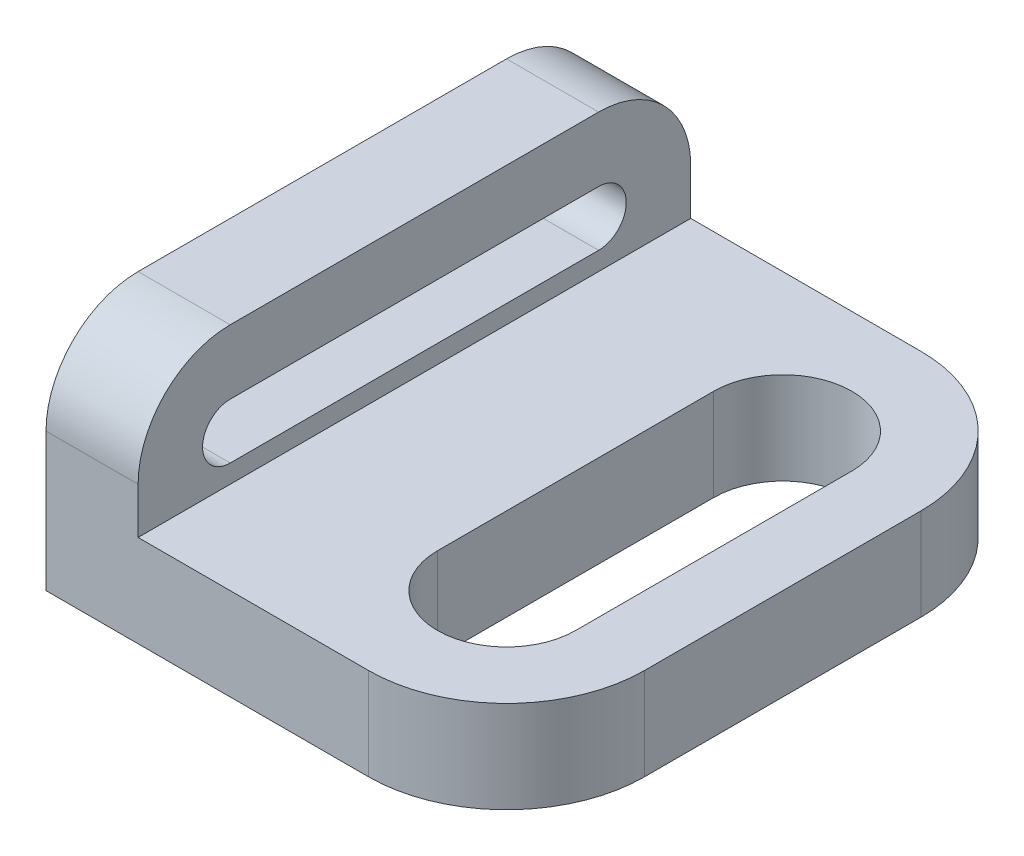
ISO-10303-21;
HEADER;
FILE_DESCRIPTION(('STEP AP214'),'2;1');
FILE_NAME('part.step','',(''),(''),'','','');
FILE_SCHEMA(('AUTOMOTIVE_DESIGN { 1 0 10303 214 1 1 1 1 }'));
ENDSEC;
DATA;
#1=APPLICATION_CONTEXT('core data for automotive mechanical design processes');
#2=APPLICATION_PROTOCOL_DEFINITION('international standard','automotive_design',2000,#1);
#3=PRODUCT_CONTEXT('',#1,'mechanical');
#4=PRODUCT('Part','Part','',(#3));
#5=PRODUCT_RELATED_PRODUCT_CATEGORY('part','',(#4));
#6=PRODUCT_DEFINITION_FORMATION('','',#4);
#7=PRODUCT_DEFINITION_CONTEXT('part definition',#1,'design');
#8=PRODUCT_DEFINITION('design','',#6,#7);
#9=PRODUCT_DEFINITION_SHAPE('','',#8);
#10=(LENGTH_UNIT() NAMED_UNIT(*) SI_UNIT(.MILLI.,.METRE.));
#11=(NAMED_UNIT(*) PLANE_ANGLE_UNIT() SI_UNIT($,.RADIAN.));
#12=(NAMED_UNIT(*) SI_UNIT($,.STERADIAN.) SOLID_ANGLE_UNIT());
#13=UNCERTAINTY_MEASURE_WITH_UNIT(LENGTH_MEASURE(1.E-05),#10,'distance_accuracy_value','');
#14=(GEOMETRIC_REPRESENTATION_CONTEXT(3) GLOBAL_UNCERTAINTY_ASSIGNED_CONTEXT((#13)) GLOBAL_UNIT_ASSIGNED_CONTEXT((#10,
#11,#12)) REPRESENTATION_CONTEXT('',''));
#15=CARTESIAN_POINT('',(0.,0.,0.));
#16=DIRECTION('',(0.,0.,1.));
#17=DIRECTION('',(1.,0.,0.));
#18=AXIS2_PLACEMENT_3D('',#15,#16,#17);
#19=CARTESIAN_POINT('',(35.,20.,0.));
#20=DIRECTION('',(-1.,0.,0.));
#21=DIRECTION('',(0.,0.,1.));
#22=AXIS2_PLACEMENT_3D('',#19,#20,#21);
#23=PLANE('',#22);
#24=DIRECTION('',(0.,0.,-1.));
#25=VECTOR('',#24,1.);
#26=CARTESIAN_POINT('',(35.,0.,0.));
#27=LINE('',#26,#25);
#28=CARTESIAN_POINT('',(35.,0.,30.));
#29=VERTEX_POINT('',#28);
#30=CARTESIAN_POINT('',(35.,0.,-30.));
#31=VERTEX_POINT('',#30);
#32=EDGE_CURVE('E183',#29,#31,#27,.T.);
#33=ORIENTED_EDGE('',*,*,#32,.F.);
#34=DIRECTION('',(0.,-1.,0.));
#35=VECTOR('',#34,1.);
#36=CARTESIAN_POINT('',(35.,20.,30.));
#37=LINE('',#36,#35);
#38=CARTESIAN_POINT('',(35.,20.,30.));
#39=VERTEX_POINT('',#38);
#40=EDGE_CURVE('E11',#39,#29,#37,.T.);
#41=ORIENTED_EDGE('',*,*,#40,.F.);
#42=DIRECTION('',(0.,0.,-1.));
#43=VECTOR('',#42,1.);
#44=CARTESIAN_POINT('',(35.,20.,0.));
#45=LINE('',#44,#43);
#46=CARTESIAN_POINT('',(35.,20.,-30.));
#47=VERTEX_POINT('',#46);
#48=EDGE_CURVE('E136',#39,#47,#45,.T.);
#49=ORIENTED_EDGE('',*,*,#48,.T.);
#50=DIRECTION('',(0.,-1.,0.));
#51=VECTOR('',#50,1.);
#52=CARTESIAN_POINT('',(35.,20.,-30.));
#53=LINE('',#52,#51);
#54=EDGE_CURVE('E68',#47,#31,#53,.T.);
#55=ORIENTED_EDGE('',*,*,#54,.T.);
#56=EDGE_LOOP('',(#33,#41,#49,#55));
#57=FACE_BOUND('',#56,.T.);
#58=ADVANCED_FACE('F41',(#57),#23,.T.);
#59=CARTESIAN_POINT('',(20.,20.,30.));
#60=DIRECTION('',(0.,-1.,0.));
#61=DIRECTION('',(0.,0.,-1.));
#62=AXIS2_PLACEMENT_3D('',#59,#60,#61);
#63=CYLINDRICAL_SURFACE('',#62,15.);
#64=CARTESIAN_POINT('',(20.,0.,30.));
#65=DIRECTION('',(0.,1.,0.));
#66=DIRECTION('',(0.,0.,1.));
#67=AXIS2_PLACEMENT_3D('',#64,#65,#66);
#68=CIRCLE('',#67,15.);
#69=CARTESIAN_POINT('',(5.00000000000003,0.,30.));
#70=VERTEX_POINT('',#69);
#71=EDGE_CURVE('E143',#29,#70,#68,.F.);
#72=ORIENTED_EDGE('',*,*,#71,.T.);
#73=DIRECTION('',(0.,-1.,0.));
#74=VECTOR('',#73,1.);
#75=CARTESIAN_POINT('',(5.00000000000003,20.,30.));
#76=LINE('',#75,#74);
#77=CARTESIAN_POINT('',(5.00000000000003,20.,30.));
#78=VERTEX_POINT('',#77);
#79=EDGE_CURVE('E51',#78,#70,#76,.T.);
#80=ORIENTED_EDGE('',*,*,#79,.F.);
#81=CARTESIAN_POINT('',(20.,20.,30.));
#82=DIRECTION('',(0.,1.,0.));
#83=DIRECTION('',(0.,0.,1.));
#84=AXIS2_PLACEMENT_3D('',#81,#82,#83);
#85=CIRCLE('',#84,15.);
#86=EDGE_CURVE('E130',#39,#78,#85,.F.);
#87=ORIENTED_EDGE('',*,*,#86,.F.);
#88=ORIENTED_EDGE('',*,*,#40,.T.);
#89=EDGE_LOOP('',(#72,#80,#87,#88));
#90=FACE_BOUND('',#89,.T.);
#91=ADVANCED_FACE('F141',(#90),#63,.F.);
#92=CARTESIAN_POINT('',(5.00000000000001,20.,0.));
#93=DIRECTION('',(1.,0.,0.));
#94=DIRECTION('',(0.,0.,-1.));
#95=AXIS2_PLACEMENT_3D('',#92,#93,#94);
#96=PLANE('',#95);
#97=DIRECTION('',(0.,0.,1.));
#98=VECTOR('',#97,1.);
#99=CARTESIAN_POINT('',(5.00000000000001,0.,0.));
#100=LINE('',#99,#98);
#101=CARTESIAN_POINT('',(5.,0.,-30.));
#102=VERTEX_POINT('',#101);
#103=EDGE_CURVE('E188',#102,#70,#100,.T.);
#104=ORIENTED_EDGE('',*,*,#103,.F.);
#105=DIRECTION('',(0.,-1.,0.));
#106=VECTOR('',#105,1.);
#107=CARTESIAN_POINT('',(5.,20.,-30.));
#108=LINE('',#107,#106);
#109=CARTESIAN_POINT('',(5.,20.,-30.));
#110=VERTEX_POINT('',#109);
#111=EDGE_CURVE('E148',#110,#102,#108,.T.);
#112=ORIENTED_EDGE('',*,*,#111,.F.);
#113=DIRECTION('',(0.,0.,1.));
#114=VECTOR('',#113,1.);
#115=CARTESIAN_POINT('',(5.00000000000001,20.,0.));
#116=LINE('',#115,#114);
#117=EDGE_CURVE('E135',#110,#78,#116,.T.);
#118=ORIENTED_EDGE('',*,*,#117,.T.);
#119=ORIENTED_EDGE('',*,*,#79,.T.);
#120=EDGE_LOOP('',(#104,#112,#118,#119));
#121=FACE_BOUND('',#120,.T.);
#122=ADVANCED_FACE('F150',(#121),#96,.T.);
#123=CARTESIAN_POINT('',(20.,20.,-30.));
#124=DIRECTION('',(0.,-1.,0.));
#125=DIRECTION('',(0.,0.,-1.));
#126=AXIS2_PLACEMENT_3D('',#123,#124,#125);
#127=CYLINDRICAL_SURFACE('',#126,30.);
#128=CARTESIAN_POINT('',(20.,0.,-30.));
#129=DIRECTION('',(0.,1.,0.));
#130=DIRECTION('',(0.,0.,1.));
#131=AXIS2_PLACEMENT_3D('',#128,#129,#130);
#132=CIRCLE('',#131,30.);
#133=CARTESIAN_POINT('',(19.9999999999998,0.,-60.));
#134=VERTEX_POINT('',#133);
#135=CARTESIAN_POINT('',(50.,0.,-29.9999999999998));
#136=VERTEX_POINT('',#135);
#137=EDGE_CURVE('E160',#134,#136,#132,.F.);
#138=ORIENTED_EDGE('',*,*,#137,.F.);
#139=DIRECTION('',(0.,-1.,0.));
#140=VECTOR('',#139,1.);
#141=CARTESIAN_POINT('',(19.9999999999998,20.,-60.));
#142=LINE('',#141,#140);
#143=CARTESIAN_POINT('',(19.9999999999998,20.,-60.));
#144=VERTEX_POINT('',#143);
#145=EDGE_CURVE('E45',#144,#134,#142,.T.);
#146=ORIENTED_EDGE('',*,*,#145,.F.);
#147=CARTESIAN_POINT('',(20.,20.,-30.));
#148=DIRECTION('',(0.,1.,0.));
#149=DIRECTION('',(0.,0.,1.));
#150=AXIS2_PLACEMENT_3D('',#147,#148,#149);
#151=CIRCLE('',#150,30.);
#152=CARTESIAN_POINT('',(50.,20.,-29.9999999999998));
#153=VERTEX_POINT('',#152);
#154=EDGE_CURVE('E195',#144,#153,#151,.F.);
#155=ORIENTED_EDGE('',*,*,#154,.T.);
#156=DIRECTION('',(0.,-1.,0.));
#157=VECTOR('',#156,1.);
#158=CARTESIAN_POINT('',(50.,20.,-29.9999999999998));
#159=LINE('',#158,#157);
#160=EDGE_CURVE('E156',#153,#136,#159,.T.);
#161=ORIENTED_EDGE('',*,*,#160,.T.);
#162=EDGE_LOOP('',(#138,#146,#155,#161));
#163=FACE_BOUND('',#162,.T.);
#164=ADVANCED_FACE('F43',(#163),#127,.T.);
#165=CARTESIAN_POINT('',(0.,20.,-60.));
#166=DIRECTION('',(0.,0.,-1.));
#167=DIRECTION('',(-1.,0.,0.));
#168=AXIS2_PLACEMENT_3D('',#165,#166,#167);
#169=PLANE('',#168);
#170=DIRECTION('',(1.,0.,0.));
#171=VECTOR('',#170,1.);
#172=CARTESIAN_POINT('',(0.,0.,-60.));
#173=LINE('',#172,#171);
#174=CARTESIAN_POINT('',(-50.,0.,-60.));
#175=VERTEX_POINT('',#174);
#176=EDGE_CURVE('E164',#175,#134,#173,.T.);
#177=ORIENTED_EDGE('',*,*,#176,.F.);
#178=DIRECTION('',(0.,-1.,0.));
#179=VECTOR('',#178,1.);
#180=CARTESIAN_POINT('',(-50.,20.,-60.));
#181=LINE('',#180,#179);
#182=CARTESIAN_POINT('',(-50.,29.9999999999999,-60.));
#183=VERTEX_POINT('',#182);
#184=EDGE_CURVE('E212',#183,#175,#181,.T.);
#185=ORIENTED_EDGE('',*,*,#184,.F.);
#186=DIRECTION('',(-1.,0.,0.));
#187=VECTOR('',#186,1.);
#188=CARTESIAN_POINT('',(-30.,29.9999999999999,-60.));
#189=LINE('',#188,#187);
#190=CARTESIAN_POINT('',(-30.,29.9999999999999,-60.));
#191=VERTEX_POINT('',#190);
#192=EDGE_CURVE('E165',#191,#183,#189,.T.);
#193=ORIENTED_EDGE('',*,*,#192,.F.);
#194=DIRECTION('',(0.,1.,0.));
#195=VECTOR('',#194,1.);
#196=CARTESIAN_POINT('',(-30.,29.9999999999999,-60.));
#197=LINE('',#196,#195);
#198=CARTESIAN_POINT('',(-30.,20.,-60.));
#199=VERTEX_POINT('',#198);
#200=EDGE_CURVE('E572',#199,#191,#197,.T.);
#201=ORIENTED_EDGE('',*,*,#200,.F.);
#202=DIRECTION('',(1.,0.,0.));
#203=VECTOR('',#202,1.);
#204=CARTESIAN_POINT('',(0.,20.,-60.));
#205=LINE('',#204,#203);
#206=EDGE_CURVE('E111',#199,#144,#205,.T.);
#207=ORIENTED_EDGE('',*,*,#206,.T.);
#208=ORIENTED_EDGE('',*,*,#145,.T.);
#209=EDGE_LOOP('',(#177,#185,#193,#201,#207,#208));
#210=FACE_BOUND('',#209,.T.);
#211=ADVANCED_FACE('F223',(#210),#169,.T.);
#212=CARTESIAN_POINT('',(-50.,20.,0.));
#213=DIRECTION('',(1.,0.,0.));
#214=DIRECTION('',(0.,0.,-1.));
#215=AXIS2_PLACEMENT_3D('',#212,#213,#214);
#216=PLANE('',#215);
#217=DIRECTION('',(0.,0.,1.));
#218=VECTOR('',#217,1.);
#219=CARTESIAN_POINT('',(-50.,0.,0.));
#220=LINE('',#219,#218);
#221=CARTESIAN_POINT('',(-50.,0.,60.));
#222=VERTEX_POINT('',#221);
#223=EDGE_CURVE('E169',#175,#222,#220,.T.);
#224=ORIENTED_EDGE('',*,*,#223,.T.);
#225=DIRECTION('',(0.,-1.,0.));
#226=VECTOR('',#225,1.);
#227=CARTESIAN_POINT('',(-50.,20.,60.));
#228=LINE('',#227,#226);
#229=CARTESIAN_POINT('',(-50.,29.9999999999999,60.));
#230=VERTEX_POINT('',#229);
#231=EDGE_CURVE('E209',#230,#222,#228,.T.);
#232=ORIENTED_EDGE('',*,*,#231,.F.);
#233=CARTESIAN_POINT('',(-50.,30.,40.));
#234=DIRECTION('',(1.,0.,0.));
#235=DIRECTION('',(0.,0.,1.));
#236=AXIS2_PLACEMENT_3D('',#233,#234,#235);
#237=CIRCLE('',#236,20.);
#238=CARTESIAN_POINT('',(-50.,50.,39.9999999999999));
#239=VERTEX_POINT('',#238);
#240=EDGE_CURVE('E268',#239,#230,#237,.T.);
#241=ORIENTED_EDGE('',*,*,#240,.F.);
#242=DIRECTION('',(0.,0.,1.));
#243=VECTOR('',#242,1.);
#244=CARTESIAN_POINT('',(-50.,50.,-39.9999999999999));
#245=LINE('',#244,#243);
#246=CARTESIAN_POINT('',(-50.,50.,-39.9999999999999));
#247=VERTEX_POINT('',#246);
#248=EDGE_CURVE('E585',#247,#239,#245,.T.);
#249=ORIENTED_EDGE('',*,*,#248,.F.);
#250=CARTESIAN_POINT('',(-50.,30.,-40.));
#251=DIRECTION('',(1.,0.,0.));
#252=DIRECTION('',(0.,0.,-1.));
#253=AXIS2_PLACEMENT_3D('',#250,#251,#252);
#254=CIRCLE('',#253,20.);
#255=EDGE_CURVE('E567',#183,#247,#254,.T.);
#256=ORIENTED_EDGE('',*,*,#255,.F.);
#257=ORIENTED_EDGE('',*,*,#184,.T.);
#258=EDGE_LOOP('',(#224,#232,#241,#249,#256,#257));
#259=FACE_BOUND('',#258,.T.);
#260=CARTESIAN_POINT('',(-50.,30.,-40.));
#261=DIRECTION('',(1.,0.,0.));
#262=DIRECTION('',(0.,0.,-1.));
#263=AXIS2_PLACEMENT_3D('',#260,#261,#262);
#264=CIRCLE('',#263,6.);
#265=CARTESIAN_POINT('',(-50.,24.,-40.));
#266=VERTEX_POINT('',#265);
#267=CARTESIAN_POINT('',(-50.,36.,-40.));
#268=VERTEX_POINT('',#267);
#269=EDGE_CURVE('E550',#266,#268,#264,.T.);
#270=ORIENTED_EDGE('',*,*,#269,.T.);
#271=DIRECTION('',(0.,0.,1.));
#272=VECTOR('',#271,1.);
#273=CARTESIAN_POINT('',(-50.,36.,-40.));
#274=LINE('',#273,#272);
#275=CARTESIAN_POINT('',(-50.,36.,40.));
#276=VERTEX_POINT('',#275);
#277=EDGE_CURVE('E544',#268,#276,#274,.T.);
#278=ORIENTED_EDGE('',*,*,#277,.T.);
#279=CARTESIAN_POINT('',(-50.,30.,40.));
#280=DIRECTION('',(1.,0.,0.));
#281=DIRECTION('',(0.,0.,1.));
#282=AXIS2_PLACEMENT_3D('',#279,#280,#281);
#283=CIRCLE('',#282,6.);
#284=CARTESIAN_POINT('',(-50.,24.,40.));
#285=VERTEX_POINT('',#284);
#286=EDGE_CURVE('E539',#276,#285,#283,.T.);
#287=ORIENTED_EDGE('',*,*,#286,.T.);
#288=DIRECTION('',(0.,0.,-1.));
#289=VECTOR('',#288,1.);
#290=CARTESIAN_POINT('',(-50.,24.,40.));
#291=LINE('',#290,#289);
#292=EDGE_CURVE('E524',#285,#266,#291,.T.);
#293=ORIENTED_EDGE('',*,*,#292,.T.);
#294=EDGE_LOOP('',(#270,#278,#287,#293));
#295=FACE_BOUND('',#294,.T.);
#296=ADVANCED_FACE('F234',(#259,#295),#216,.F.);
#297=CARTESIAN_POINT('',(0.,20.,60.));
#298=DIRECTION('',(0.,0.,-1.));
#299=DIRECTION('',(-1.,0.,0.));
#300=AXIS2_PLACEMENT_3D('',#297,#298,#299);
#301=PLANE('',#300);
#302=DIRECTION('',(1.,0.,0.));
#303=VECTOR('',#302,1.);
#304=CARTESIAN_POINT('',(0.,0.,60.));
#305=LINE('',#304,#303);
#306=CARTESIAN_POINT('',(19.9999999999998,0.,60.));
#307=VERTEX_POINT('',#306);
#308=EDGE_CURVE('E172',#222,#307,#305,.T.);
#309=ORIENTED_EDGE('',*,*,#308,.T.);
#310=DIRECTION('',(0.,-1.,0.));
#311=VECTOR('',#310,1.);
#312=CARTESIAN_POINT('',(19.9999999999998,20.,60.));
#313=LINE('',#312,#311);
#314=CARTESIAN_POINT('',(19.9999999999998,20.,60.));
#315=VERTEX_POINT('',#314);
#316=EDGE_CURVE('E205',#315,#307,#313,.T.);
#317=ORIENTED_EDGE('',*,*,#316,.F.);
#318=DIRECTION('',(1.,0.,0.));
#319=VECTOR('',#318,1.);
#320=CARTESIAN_POINT('',(0.,20.,60.));
#321=LINE('',#320,#319);
#322=CARTESIAN_POINT('',(-30.,20.,60.));
#323=VERTEX_POINT('',#322);
#324=EDGE_CURVE('E281',#323,#315,#321,.T.);
#325=ORIENTED_EDGE('',*,*,#324,.F.);
#326=DIRECTION('',(0.,-1.,0.));
#327=VECTOR('',#326,1.);
#328=CARTESIAN_POINT('',(-30.,29.9999999999999,60.));
#329=LINE('',#328,#327);
#330=CARTESIAN_POINT('',(-30.,29.9999999999999,60.));
#331=VERTEX_POINT('',#330);
#332=EDGE_CURVE('E248',#331,#323,#329,.T.);
#333=ORIENTED_EDGE('',*,*,#332,.F.);
#334=DIRECTION('',(-1.,0.,0.));
#335=VECTOR('',#334,1.);
#336=CARTESIAN_POINT('',(-30.,29.9999999999999,60.));
#337=LINE('',#336,#335);
#338=EDGE_CURVE('E245',#331,#230,#337,.T.);
#339=ORIENTED_EDGE('',*,*,#338,.T.);
#340=ORIENTED_EDGE('',*,*,#231,.T.);
#341=EDGE_LOOP('',(#309,#317,#325,#333,#339,#340));
#342=FACE_BOUND('',#341,.T.);
#343=ADVANCED_FACE('F241',(#342),#301,.F.);
#344=CARTESIAN_POINT('',(20.,20.,30.));
#345=DIRECTION('',(0.,-1.,0.));
#346=DIRECTION('',(0.,0.,-1.));
#347=AXIS2_PLACEMENT_3D('',#344,#345,#346);
#348=CYLINDRICAL_SURFACE('',#347,30.);
#349=CARTESIAN_POINT('',(20.,0.,30.));
#350=DIRECTION('',(0.,1.,0.));
#351=DIRECTION('',(0.,0.,1.));
#352=AXIS2_PLACEMENT_3D('',#349,#350,#351);
#353=CIRCLE('',#352,30.);
#354=CARTESIAN_POINT('',(50.,0.,29.9999999999998));
#355=VERTEX_POINT('',#354);
#356=EDGE_CURVE('E175',#307,#355,#353,.T.);
#357=ORIENTED_EDGE('',*,*,#356,.T.);
#358=DIRECTION('',(0.,-1.,0.));
#359=VECTOR('',#358,1.);
#360=CARTESIAN_POINT('',(50.,20.,29.9999999999998));
#361=LINE('',#360,#359);
#362=CARTESIAN_POINT('',(50.,20.,29.9999999999998));
#363=VERTEX_POINT('',#362);
#364=EDGE_CURVE('E202',#363,#355,#361,.T.);
#365=ORIENTED_EDGE('',*,*,#364,.F.);
#366=CARTESIAN_POINT('',(20.,20.,30.));
#367=DIRECTION('',(0.,1.,0.));
#368=DIRECTION('',(0.,0.,1.));
#369=AXIS2_PLACEMENT_3D('',#366,#367,#368);
#370=CIRCLE('',#369,30.);
#371=EDGE_CURVE('E284',#315,#363,#370,.T.);
#372=ORIENTED_EDGE('',*,*,#371,.F.);
#373=ORIENTED_EDGE('',*,*,#316,.T.);
#374=EDGE_LOOP('',(#357,#365,#372,#373));
#375=FACE_BOUND('',#374,.T.);
#376=ADVANCED_FACE('F316',(#375),#348,.T.);
#377=CARTESIAN_POINT('',(50.,20.,0.));
#378=DIRECTION('',(1.,0.,0.));
#379=DIRECTION('',(0.,0.,-1.));
#380=AXIS2_PLACEMENT_3D('',#377,#378,#379);
#381=PLANE('',#380);
#382=DIRECTION('',(0.,0.,1.));
#383=VECTOR('',#382,1.);
#384=CARTESIAN_POINT('',(50.,0.,0.));
#385=LINE('',#384,#383);
#386=EDGE_CURVE('E179',#136,#355,#385,.T.);
#387=ORIENTED_EDGE('',*,*,#386,.F.);
#388=ORIENTED_EDGE('',*,*,#160,.F.);
#389=DIRECTION('',(0.,0.,1.));
#390=VECTOR('',#389,1.);
#391=CARTESIAN_POINT('',(50.,20.,0.));
#392=LINE('',#391,#390);
#393=EDGE_CURVE('E287',#153,#363,#392,.T.);
#394=ORIENTED_EDGE('',*,*,#393,.T.);
#395=ORIENTED_EDGE('',*,*,#364,.T.);
#396=EDGE_LOOP('',(#387,#388,#394,#395));
#397=FACE_BOUND('',#396,.T.);
#398=ADVANCED_FACE('F313',(#397),#381,.T.);
#399=CARTESIAN_POINT('',(20.,20.,-30.));
#400=DIRECTION('',(0.,-1.,0.));
#401=DIRECTION('',(0.,0.,-1.));
#402=AXIS2_PLACEMENT_3D('',#399,#400,#401);
#403=CYLINDRICAL_SURFACE('',#402,15.);
#404=CARTESIAN_POINT('',(20.,0.,-30.));
#405=DIRECTION('',(0.,1.,0.));
#406=DIRECTION('',(0.,0.,1.));
#407=AXIS2_PLACEMENT_3D('',#404,#405,#406);
#408=CIRCLE('',#407,15.);
#409=EDGE_CURVE('E191',#31,#102,#408,.T.);
#410=ORIENTED_EDGE('',*,*,#409,.F.);
#411=ORIENTED_EDGE('',*,*,#54,.F.);
#412=CARTESIAN_POINT('',(20.,20.,-30.));
#413=DIRECTION('',(0.,1.,0.));
#414=DIRECTION('',(0.,0.,1.));
#415=AXIS2_PLACEMENT_3D('',#412,#413,#414);
#416=CIRCLE('',#415,15.);
#417=EDGE_CURVE('E152',#47,#110,#416,.T.);
#418=ORIENTED_EDGE('',*,*,#417,.T.);
#419=ORIENTED_EDGE('',*,*,#111,.T.);
#420=EDGE_LOOP('',(#410,#411,#418,#419));
#421=FACE_BOUND('',#420,.T.);
#422=ADVANCED_FACE('F292',(#421),#403,.F.);
#423=CARTESIAN_POINT('',(0.,20.,0.));
#424=DIRECTION('',(0.,1.,0.));
#425=DIRECTION('',(0.,0.,1.));
#426=AXIS2_PLACEMENT_3D('',#423,#424,#425);
#427=PLANE('',#426);
#428=DIRECTION('',(0.,0.,-1.));
#429=VECTOR('',#428,1.);
#430=CARTESIAN_POINT('',(-30.,20.,-60.));
#431=LINE('',#430,#429);
#432=EDGE_CURVE('E59',#323,#199,#431,.T.);
#433=ORIENTED_EDGE('',*,*,#432,.F.);
#434=ORIENTED_EDGE('',*,*,#324,.T.);
#435=ORIENTED_EDGE('',*,*,#371,.T.);
#436=ORIENTED_EDGE('',*,*,#393,.F.);
#437=ORIENTED_EDGE('',*,*,#154,.F.);
#438=ORIENTED_EDGE('',*,*,#206,.F.);
#439=EDGE_LOOP('',(#433,#434,#435,#436,#437,#438));
#440=FACE_BOUND('',#439,.T.);
#441=ORIENTED_EDGE('',*,*,#48,.F.);
#442=ORIENTED_EDGE('',*,*,#86,.T.);
#443=ORIENTED_EDGE('',*,*,#117,.F.);
#444=ORIENTED_EDGE('',*,*,#417,.F.);
#445=EDGE_LOOP('',(#441,#442,#443,#444));
#446=FACE_BOUND('',#445,.T.);
#447=ADVANCED_FACE('F132',(#440,#446),#427,.T.);
#448=CARTESIAN_POINT('',(0.,0.,0.));
#449=DIRECTION('',(0.,1.,0.));
#450=DIRECTION('',(0.,0.,1.));
#451=AXIS2_PLACEMENT_3D('',#448,#449,#450);
#452=PLANE('',#451);
#453=ORIENTED_EDGE('',*,*,#137,.T.);
#454=ORIENTED_EDGE('',*,*,#386,.T.);
#455=ORIENTED_EDGE('',*,*,#356,.F.);
#456=ORIENTED_EDGE('',*,*,#308,.F.);
#457=ORIENTED_EDGE('',*,*,#223,.F.);
#458=ORIENTED_EDGE('',*,*,#176,.T.);
#459=EDGE_LOOP('',(#453,#454,#455,#456,#457,#458));
#460=FACE_BOUND('',#459,.T.);
#461=ORIENTED_EDGE('',*,*,#32,.T.);
#462=ORIENTED_EDGE('',*,*,#409,.T.);
#463=ORIENTED_EDGE('',*,*,#103,.T.);
#464=ORIENTED_EDGE('',*,*,#71,.F.);
#465=EDGE_LOOP('',(#461,#462,#463,#464));
#466=FACE_BOUND('',#465,.T.);
#467=ADVANCED_FACE('F229',(#460,#466),#452,.F.);
#468=CARTESIAN_POINT('',(-30.,30.,-40.));
#469=DIRECTION('',(1.,0.,0.));
#470=DIRECTION('',(0.,0.,-1.));
#471=AXIS2_PLACEMENT_3D('',#468,#469,#470);
#472=PLANE('',#471);
#473=ORIENTED_EDGE('',*,*,#332,.T.);
#474=ORIENTED_EDGE('',*,*,#432,.T.);
#475=ORIENTED_EDGE('',*,*,#200,.T.);
#476=CARTESIAN_POINT('',(-30.,30.,-40.));
#477=DIRECTION('',(1.,0.,0.));
#478=DIRECTION('',(0.,0.,-1.));
#479=AXIS2_PLACEMENT_3D('',#476,#477,#478);
#480=CIRCLE('',#479,20.);
#481=CARTESIAN_POINT('',(-30.,50.,-39.9999999999999));
#482=VERTEX_POINT('',#481);
#483=EDGE_CURVE('E576',#191,#482,#480,.T.);
#484=ORIENTED_EDGE('',*,*,#483,.T.);
#485=DIRECTION('',(0.,0.,1.));
#486=VECTOR('',#485,1.);
#487=CARTESIAN_POINT('',(-30.,50.,-39.9999999999999));
#488=LINE('',#487,#486);
#489=CARTESIAN_POINT('',(-30.,50.,39.9999999999999));
#490=VERTEX_POINT('',#489);
#491=EDGE_CURVE('E265',#482,#490,#488,.T.);
#492=ORIENTED_EDGE('',*,*,#491,.T.);
#493=CARTESIAN_POINT('',(-30.,30.,40.));
#494=DIRECTION('',(1.,0.,0.));
#495=DIRECTION('',(0.,0.,1.));
#496=AXIS2_PLACEMENT_3D('',#493,#494,#495);
#497=CIRCLE('',#496,20.);
#498=EDGE_CURVE('E256',#490,#331,#497,.T.);
#499=ORIENTED_EDGE('',*,*,#498,.T.);
#500=EDGE_LOOP('',(#473,#474,#475,#484,#492,#499));
#501=FACE_BOUND('',#500,.T.);
#502=DIRECTION('',(0.,0.,1.));
#503=VECTOR('',#502,1.);
#504=CARTESIAN_POINT('',(-30.,36.,-40.));
#505=LINE('',#504,#503);
#506=CARTESIAN_POINT('',(-30.,36.,-40.));
#507=VERTEX_POINT('',#506);
#508=CARTESIAN_POINT('',(-30.,36.,40.));
#509=VERTEX_POINT('',#508);
#510=EDGE_CURVE('E625',#507,#509,#505,.T.);
#511=ORIENTED_EDGE('',*,*,#510,.F.);
#512=CARTESIAN_POINT('',(-30.,30.,-40.));
#513=DIRECTION('',(1.,0.,0.));
#514=DIRECTION('',(0.,0.,-1.));
#515=AXIS2_PLACEMENT_3D('',#512,#513,#514);
#516=CIRCLE('',#515,6.);
#517=CARTESIAN_POINT('',(-30.,24.,-40.));
#518=VERTEX_POINT('',#517);
#519=EDGE_CURVE('E538',#518,#507,#516,.T.);
#520=ORIENTED_EDGE('',*,*,#519,.F.);
#521=DIRECTION('',(0.,0.,-1.));
#522=VECTOR('',#521,1.);
#523=CARTESIAN_POINT('',(-30.,24.,40.));
#524=LINE('',#523,#522);
#525=CARTESIAN_POINT('',(-30.,24.,40.));
#526=VERTEX_POINT('',#525);
#527=EDGE_CURVE('E556',#526,#518,#524,.T.);
#528=ORIENTED_EDGE('',*,*,#527,.F.);
#529=CARTESIAN_POINT('',(-30.,30.,40.));
#530=DIRECTION('',(1.,0.,0.));
#531=DIRECTION('',(0.,0.,1.));
#532=AXIS2_PLACEMENT_3D('',#529,#530,#531);
#533=CIRCLE('',#532,6.);
#534=EDGE_CURVE('E627',#509,#526,#533,.T.);
#535=ORIENTED_EDGE('',*,*,#534,.F.);
#536=EDGE_LOOP('',(#511,#520,#528,#535));
#537=FACE_BOUND('',#536,.T.);
#538=ADVANCED_FACE('F294',(#501,#537),#472,.T.);
#539=CARTESIAN_POINT('',(-30.,30.,-40.));
#540=DIRECTION('',(-1.,0.,0.));
#541=DIRECTION('',(0.,0.,1.));
#542=AXIS2_PLACEMENT_3D('',#539,#540,#541);
#543=CYLINDRICAL_SURFACE('',#542,20.);
#544=ORIENTED_EDGE('',*,*,#255,.T.);
#545=DIRECTION('',(-1.,0.,0.));
#546=VECTOR('',#545,1.);
#547=CARTESIAN_POINT('',(-30.,50.,-39.9999999999999));
#548=LINE('',#547,#546);
#549=EDGE_CURVE('E262',#482,#247,#548,.T.);
#550=ORIENTED_EDGE('',*,*,#549,.F.);
#551=ORIENTED_EDGE('',*,*,#483,.F.);
#552=ORIENTED_EDGE('',*,*,#192,.T.);
#553=EDGE_LOOP('',(#544,#550,#551,#552));
#554=FACE_BOUND('',#553,.T.);
#555=ADVANCED_FACE('F300',(#554),#543,.T.);
#556=CARTESIAN_POINT('',(-30.,50.,-39.9999999999999));
#557=DIRECTION('',(0.,-1.,0.));
#558=DIRECTION('',(0.,0.,-1.));
#559=AXIS2_PLACEMENT_3D('',#556,#557,#558);
#560=PLANE('',#559);
#561=ORIENTED_EDGE('',*,*,#248,.T.);
#562=DIRECTION('',(-1.,0.,0.));
#563=VECTOR('',#562,1.);
#564=CARTESIAN_POINT('',(-30.,50.,39.9999999999999));
#565=LINE('',#564,#563);
#566=EDGE_CURVE('E255',#490,#239,#565,.T.);
#567=ORIENTED_EDGE('',*,*,#566,.F.);
#568=ORIENTED_EDGE('',*,*,#491,.F.);
#569=ORIENTED_EDGE('',*,*,#549,.T.);
#570=EDGE_LOOP('',(#561,#567,#568,#569));
#571=FACE_BOUND('',#570,.T.);
#572=ADVANCED_FACE('F364',(#571),#560,.F.);
#573=CARTESIAN_POINT('',(-30.,30.,40.));
#574=DIRECTION('',(-1.,0.,0.));
#575=DIRECTION('',(0.,0.,1.));
#576=AXIS2_PLACEMENT_3D('',#573,#574,#575);
#577=CYLINDRICAL_SURFACE('',#576,20.);
#578=ORIENTED_EDGE('',*,*,#240,.T.);
#579=ORIENTED_EDGE('',*,*,#338,.F.);
#580=ORIENTED_EDGE('',*,*,#498,.F.);
#581=ORIENTED_EDGE('',*,*,#566,.T.);
#582=EDGE_LOOP('',(#578,#579,#580,#581));
#583=FACE_BOUND('',#582,.T.);
#584=ADVANCED_FACE('F375',(#583),#577,.T.);
#585=CARTESIAN_POINT('',(-30.,30.,-40.));
#586=DIRECTION('',(-1.,0.,0.));
#587=DIRECTION('',(0.,0.,1.));
#588=AXIS2_PLACEMENT_3D('',#585,#586,#587);
#589=CYLINDRICAL_SURFACE('',#588,6.);
#590=ORIENTED_EDGE('',*,*,#269,.F.);
#591=DIRECTION('',(-1.,0.,0.));
#592=VECTOR('',#591,1.);
#593=CARTESIAN_POINT('',(-30.,24.,-40.));
#594=LINE('',#593,#592);
#595=EDGE_CURVE('E532',#518,#266,#594,.T.);
#596=ORIENTED_EDGE('',*,*,#595,.F.);
#597=ORIENTED_EDGE('',*,*,#519,.T.);
#598=DIRECTION('',(-1.,0.,0.));
#599=VECTOR('',#598,1.);
#600=CARTESIAN_POINT('',(-30.,36.,-40.));
#601=LINE('',#600,#599);
#602=EDGE_CURVE('E563',#507,#268,#601,.T.);
#603=ORIENTED_EDGE('',*,*,#602,.T.);
#604=EDGE_LOOP('',(#590,#596,#597,#603));
#605=FACE_BOUND('',#604,.T.);
#606=ADVANCED_FACE('F386',(#605),#589,.F.);
#607=CARTESIAN_POINT('',(-30.,36.,-40.));
#608=DIRECTION('',(0.,-1.,0.));
#609=DIRECTION('',(0.,0.,-1.));
#610=AXIS2_PLACEMENT_3D('',#607,#608,#609);
#611=PLANE('',#610);
#612=ORIENTED_EDGE('',*,*,#277,.F.);
#613=ORIENTED_EDGE('',*,*,#602,.F.);
#614=ORIENTED_EDGE('',*,*,#510,.T.);
#615=DIRECTION('',(-1.,0.,0.));
#616=VECTOR('',#615,1.);
#617=CARTESIAN_POINT('',(-30.,36.,40.));
#618=LINE('',#617,#616);
#619=EDGE_CURVE('E559',#509,#276,#618,.T.);
#620=ORIENTED_EDGE('',*,*,#619,.T.);
#621=EDGE_LOOP('',(#612,#613,#614,#620));
#622=FACE_BOUND('',#621,.T.);
#623=ADVANCED_FACE('F396',(#622),#611,.T.);
#624=CARTESIAN_POINT('',(-30.,30.,40.));
#625=DIRECTION('',(-1.,0.,0.));
#626=DIRECTION('',(0.,0.,1.));
#627=AXIS2_PLACEMENT_3D('',#624,#625,#626);
#628=CYLINDRICAL_SURFACE('',#627,6.);
#629=ORIENTED_EDGE('',*,*,#286,.F.);
#630=ORIENTED_EDGE('',*,*,#619,.F.);
#631=ORIENTED_EDGE('',*,*,#534,.T.);
#632=DIRECTION('',(-1.,0.,0.));
#633=VECTOR('',#632,1.);
#634=CARTESIAN_POINT('',(-30.,24.,40.));
#635=LINE('',#634,#633);
#636=EDGE_CURVE('E528',#526,#285,#635,.T.);
#637=ORIENTED_EDGE('',*,*,#636,.T.);
#638=EDGE_LOOP('',(#629,#630,#631,#637));
#639=FACE_BOUND('',#638,.T.);
#640=ADVANCED_FACE('F407',(#639),#628,.F.);
#641=CARTESIAN_POINT('',(-30.,24.,40.));
#642=DIRECTION('',(0.,1.,0.));
#643=DIRECTION('',(0.,0.,1.));
#644=AXIS2_PLACEMENT_3D('',#641,#642,#643);
#645=PLANE('',#644);
#646=ORIENTED_EDGE('',*,*,#292,.F.);
#647=ORIENTED_EDGE('',*,*,#636,.F.);
#648=ORIENTED_EDGE('',*,*,#527,.T.);
#649=ORIENTED_EDGE('',*,*,#595,.T.);
#650=EDGE_LOOP('',(#646,#647,#648,#649));
#651=FACE_BOUND('',#650,.T.);
#652=ADVANCED_FACE('F418',(#651),#645,.T.);
#653=CLOSED_SHELL('',(#58,#91,#122,#164,#211,#296,#343,#376,#398,#422,#447,#467,#538,#555,#572,
#584,#606,#623,#640,#652));
#654=MANIFOLD_SOLID_BREP('B2',#653);
#655=ADVANCED_BREP_SHAPE_REPRESENTATION('',(#18,#654),#14);
#656=SHAPE_DEFINITION_REPRESENTATION(#9,#655);
ENDSEC;
END-ISO-10303-21;
